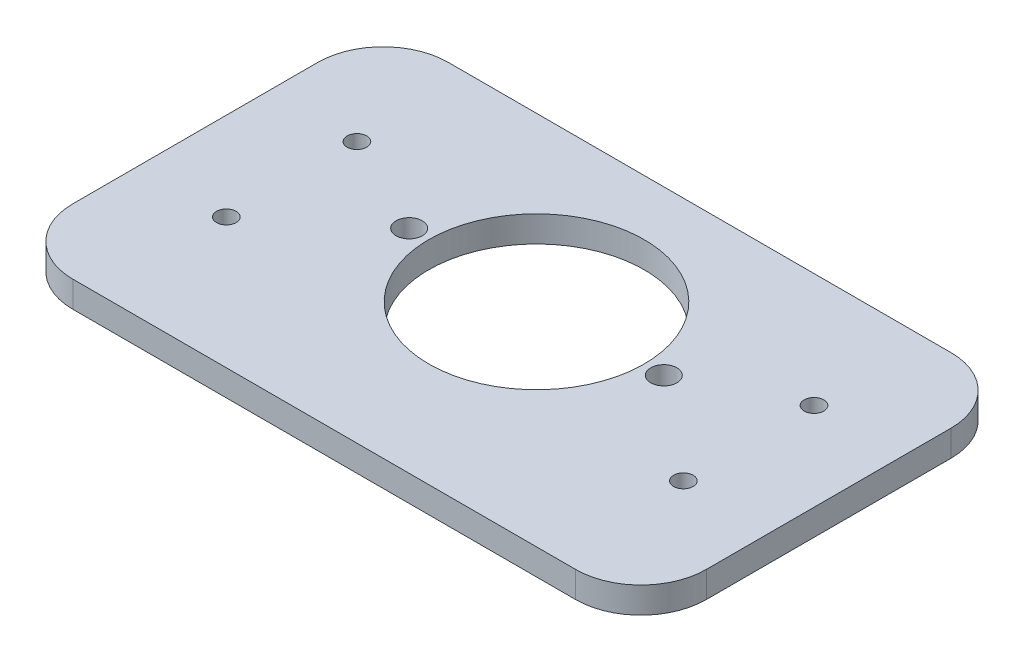
ISO-10303-21;
HEADER;
FILE_DESCRIPTION(('STEP AP214'),'2;1');
FILE_NAME('part.step','',(''),(''),'','','');
FILE_SCHEMA(('AUTOMOTIVE_DESIGN { 1 0 10303 214 1 1 1 1 }'));
ENDSEC;
DATA;
#1=APPLICATION_CONTEXT('core data for automotive mechanical design processes');
#2=APPLICATION_PROTOCOL_DEFINITION('international standard','automotive_design',2000,#1);
#3=PRODUCT_CONTEXT('',#1,'mechanical');
#4=PRODUCT('Part','Part','',(#3));
#5=PRODUCT_RELATED_PRODUCT_CATEGORY('part','',(#4));
#6=PRODUCT_DEFINITION_FORMATION('','',#4);
#7=PRODUCT_DEFINITION_CONTEXT('part definition',#1,'design');
#8=PRODUCT_DEFINITION('design','',#6,#7);
#9=PRODUCT_DEFINITION_SHAPE('','',#8);
#10=(LENGTH_UNIT() NAMED_UNIT(*) SI_UNIT(.MILLI.,.METRE.));
#11=(NAMED_UNIT(*) PLANE_ANGLE_UNIT() SI_UNIT($,.RADIAN.));
#12=(NAMED_UNIT(*) SI_UNIT($,.STERADIAN.) SOLID_ANGLE_UNIT());
#13=UNCERTAINTY_MEASURE_WITH_UNIT(LENGTH_MEASURE(1.E-05),#10,'distance_accuracy_value','');
#14=(GEOMETRIC_REPRESENTATION_CONTEXT(3) GLOBAL_UNCERTAINTY_ASSIGNED_CONTEXT((#13)) GLOBAL_UNIT_ASSIGNED_CONTEXT((#10,
#11,#12)) REPRESENTATION_CONTEXT('',''));
#15=CARTESIAN_POINT('',(0.,0.,0.));
#16=DIRECTION('',(0.,0.,1.));
#17=DIRECTION('',(1.,0.,0.));
#18=AXIS2_PLACEMENT_3D('',#15,#16,#17);
#19=CARTESIAN_POINT('',(0.,4.,0.));
#20=DIRECTION('',(0.,-1.,0.));
#21=DIRECTION('',(0.,0.,-1.));
#22=AXIS2_PLACEMENT_3D('',#19,#20,#21);
#23=PLANE('',#22);
#24=CARTESIAN_POINT('',(83.5,4.,-20.));
#25=DIRECTION('',(0.,1.,0.));
#26=DIRECTION('',(0.,0.,-1.));
#27=AXIS2_PLACEMENT_3D('',#24,#25,#26);
#28=CIRCLE('',#27,1.50000000000001);
#29=CARTESIAN_POINT('',(83.5,4.,-21.5));
#30=VERTEX_POINT('',#29);
#31=EDGE_CURVE('E398',#30,#30,#28,.T.);
#32=ORIENTED_EDGE('',*,*,#31,.F.);
#33=EDGE_LOOP('',(#32));
#34=FACE_BOUND('',#33,.T.);
#35=CARTESIAN_POINT('',(83.5000000000001,4.,-40.));
#36=DIRECTION('',(0.,1.,0.));
#37=DIRECTION('',(0.,0.,-1.));
#38=AXIS2_PLACEMENT_3D('',#35,#36,#37);
#39=CIRCLE('',#38,1.5);
#40=CARTESIAN_POINT('',(83.5000000000001,4.,-41.5));
#41=VERTEX_POINT('',#40);
#42=EDGE_CURVE('E400',#41,#41,#39,.T.);
#43=ORIENTED_EDGE('',*,*,#42,.F.);
#44=EDGE_LOOP('',(#43));
#45=FACE_BOUND('',#44,.T.);
#46=CARTESIAN_POINT('',(13.4999999999999,4.,-40.));
#47=DIRECTION('',(0.,1.,0.));
#48=DIRECTION('',(0.,0.,1.));
#49=AXIS2_PLACEMENT_3D('',#46,#47,#48);
#50=CIRCLE('',#49,1.50000000000001);
#51=CARTESIAN_POINT('',(13.4999999999999,4.,-38.5));
#52=VERTEX_POINT('',#51);
#53=EDGE_CURVE('E404',#52,#52,#50,.T.);
#54=ORIENTED_EDGE('',*,*,#53,.F.);
#55=EDGE_LOOP('',(#54));
#56=FACE_BOUND('',#55,.T.);
#57=CARTESIAN_POINT('',(13.5,4.,-20.));
#58=DIRECTION('',(0.,1.,0.));
#59=DIRECTION('',(0.,0.,1.));
#60=AXIS2_PLACEMENT_3D('',#57,#58,#59);
#61=CIRCLE('',#60,1.50000000000001);
#62=CARTESIAN_POINT('',(13.5,4.,-18.5));
#63=VERTEX_POINT('',#62);
#64=EDGE_CURVE('E193',#63,#63,#61,.T.);
#65=ORIENTED_EDGE('',*,*,#64,.F.);
#66=EDGE_LOOP('',(#65));
#67=FACE_BOUND('',#66,.T.);
#68=DIRECTION('',(0.,0.,1.));
#69=VECTOR('',#68,1.);
#70=CARTESIAN_POINT('',(0.,4.,0.));
#71=LINE('',#70,#69);
#72=CARTESIAN_POINT('',(0.,4.,-47.5));
#73=VERTEX_POINT('',#72);
#74=CARTESIAN_POINT('',(0.,4.,-10.));
#75=VERTEX_POINT('',#74);
#76=EDGE_CURVE('E152',#73,#75,#71,.T.);
#77=ORIENTED_EDGE('',*,*,#76,.T.);
#78=CARTESIAN_POINT('',(10.,4.,-10.));
#79=DIRECTION('',(0.,-1.,0.));
#80=DIRECTION('',(0.,0.,-1.));
#81=AXIS2_PLACEMENT_3D('',#78,#79,#80);
#82=CIRCLE('',#81,10.);
#83=CARTESIAN_POINT('',(10.,4.,0.));
#84=VERTEX_POINT('',#83);
#85=EDGE_CURVE('E176',#75,#84,#82,.F.);
#86=ORIENTED_EDGE('',*,*,#85,.T.);
#87=DIRECTION('',(1.,0.,0.));
#88=VECTOR('',#87,1.);
#89=CARTESIAN_POINT('',(0.,4.,0.));
#90=LINE('',#89,#88);
#91=CARTESIAN_POINT('',(87.,4.,0.));
#92=VERTEX_POINT('',#91);
#93=EDGE_CURVE('E129',#84,#92,#90,.T.);
#94=ORIENTED_EDGE('',*,*,#93,.T.);
#95=CARTESIAN_POINT('',(87.,4.,-10.));
#96=DIRECTION('',(0.,-1.,0.));
#97=DIRECTION('',(0.,0.,-1.));
#98=AXIS2_PLACEMENT_3D('',#95,#96,#97);
#99=CIRCLE('',#98,10.);
#100=CARTESIAN_POINT('',(97.,4.,-10.));
#101=VERTEX_POINT('',#100);
#102=EDGE_CURVE('E173',#92,#101,#99,.F.);
#103=ORIENTED_EDGE('',*,*,#102,.T.);
#104=DIRECTION('',(0.,0.,-1.));
#105=VECTOR('',#104,1.);
#106=CARTESIAN_POINT('',(97.,4.,0.));
#107=LINE('',#106,#105);
#108=CARTESIAN_POINT('',(97.,4.,-47.5));
#109=VERTEX_POINT('',#108);
#110=EDGE_CURVE('E237',#101,#109,#107,.T.);
#111=ORIENTED_EDGE('',*,*,#110,.T.);
#112=CARTESIAN_POINT('',(87.,4.,-47.5));
#113=DIRECTION('',(0.,-1.,0.));
#114=DIRECTION('',(0.,0.,-1.));
#115=AXIS2_PLACEMENT_3D('',#112,#113,#114);
#116=CIRCLE('',#115,10.);
#117=CARTESIAN_POINT('',(87.,4.,-57.5));
#118=VERTEX_POINT('',#117);
#119=EDGE_CURVE('E63',#109,#118,#116,.F.);
#120=ORIENTED_EDGE('',*,*,#119,.T.);
#121=DIRECTION('',(-1.,0.,0.));
#122=VECTOR('',#121,1.);
#123=CARTESIAN_POINT('',(0.,4.,-57.5));
#124=LINE('',#123,#122);
#125=CARTESIAN_POINT('',(10.,4.,-57.5));
#126=VERTEX_POINT('',#125);
#127=EDGE_CURVE('E154',#118,#126,#124,.T.);
#128=ORIENTED_EDGE('',*,*,#127,.T.);
#129=CARTESIAN_POINT('',(10.,4.,-47.5));
#130=DIRECTION('',(0.,-1.,0.));
#131=DIRECTION('',(0.,0.,-1.));
#132=AXIS2_PLACEMENT_3D('',#129,#130,#131);
#133=CIRCLE('',#132,10.);
#134=EDGE_CURVE('E168',#126,#73,#133,.F.);
#135=ORIENTED_EDGE('',*,*,#134,.T.);
#136=EDGE_LOOP('',(#77,#86,#94,#103,#111,#120,#128,#135));
#137=FACE_BOUND('',#136,.T.);
#138=CARTESIAN_POINT('',(48.5,4.,-32.5));
#139=DIRECTION('',(0.,1.,0.));
#140=DIRECTION('',(0.,0.,1.));
#141=AXIS2_PLACEMENT_3D('',#138,#139,#140);
#142=CIRCLE('',#141,16.5);
#143=CARTESIAN_POINT('',(48.5,4.,-16.));
#144=VERTEX_POINT('',#143);
#145=EDGE_CURVE('E146',#144,#144,#142,.T.);
#146=ORIENTED_EDGE('',*,*,#145,.F.);
#147=EDGE_LOOP('',(#146));
#148=FACE_BOUND('',#147,.T.);
#149=CARTESIAN_POINT('',(29.,4.,-32.5));
#150=DIRECTION('',(0.,1.,0.));
#151=DIRECTION('',(0.,0.,1.));
#152=AXIS2_PLACEMENT_3D('',#149,#150,#151);
#153=CIRCLE('',#152,2.00000000000001);
#154=CARTESIAN_POINT('',(29.,4.,-30.5));
#155=VERTEX_POINT('',#154);
#156=EDGE_CURVE('E218',#155,#155,#153,.T.);
#157=ORIENTED_EDGE('',*,*,#156,.F.);
#158=EDGE_LOOP('',(#157));
#159=FACE_BOUND('',#158,.T.);
#160=CARTESIAN_POINT('',(68.,4.,-32.5));
#161=DIRECTION('',(0.,1.,0.));
#162=DIRECTION('',(0.,0.,-1.));
#163=AXIS2_PLACEMENT_3D('',#160,#161,#162);
#164=CIRCLE('',#163,2.);
#165=CARTESIAN_POINT('',(68.,4.,-34.5));
#166=VERTEX_POINT('',#165);
#167=EDGE_CURVE('E208',#166,#166,#164,.T.);
#168=ORIENTED_EDGE('',*,*,#167,.F.);
#169=EDGE_LOOP('',(#168));
#170=FACE_BOUND('',#169,.T.);
#171=ADVANCED_FACE('F39',(#34,#45,#56,#67,#137,#148,#159,#170),#23,.F.);
#172=CARTESIAN_POINT('',(0.,0.,0.));
#173=DIRECTION('',(0.,-1.,0.));
#174=DIRECTION('',(0.,0.,-1.));
#175=AXIS2_PLACEMENT_3D('',#172,#173,#174);
#176=PLANE('',#175);
#177=CARTESIAN_POINT('',(83.5,0.,-20.));
#178=DIRECTION('',(0.,-1.,0.));
#179=DIRECTION('',(0.,0.,-1.));
#180=AXIS2_PLACEMENT_3D('',#177,#178,#179);
#181=CIRCLE('',#180,1.50000000000001);
#182=CARTESIAN_POINT('',(83.5,0.,-21.5));
#183=VERTEX_POINT('',#182);
#184=EDGE_CURVE('E43',#183,#183,#181,.T.);
#185=ORIENTED_EDGE('',*,*,#184,.F.);
#186=EDGE_LOOP('',(#185));
#187=FACE_BOUND('',#186,.T.);
#188=CARTESIAN_POINT('',(83.5000000000001,0.,-40.));
#189=DIRECTION('',(0.,-1.,0.));
#190=DIRECTION('',(0.,0.,-1.));
#191=AXIS2_PLACEMENT_3D('',#188,#189,#190);
#192=CIRCLE('',#191,1.5);
#193=CARTESIAN_POINT('',(83.5000000000001,0.,-41.5));
#194=VERTEX_POINT('',#193);
#195=EDGE_CURVE('E196',#194,#194,#192,.T.);
#196=ORIENTED_EDGE('',*,*,#195,.F.);
#197=EDGE_LOOP('',(#196));
#198=FACE_BOUND('',#197,.T.);
#199=CARTESIAN_POINT('',(13.4999999999999,0.,-40.));
#200=DIRECTION('',(0.,-1.,0.));
#201=DIRECTION('',(0.,0.,-1.));
#202=AXIS2_PLACEMENT_3D('',#199,#200,#201);
#203=CIRCLE('',#202,1.50000000000001);
#204=CARTESIAN_POINT('',(13.4999999999999,0.,-41.5));
#205=VERTEX_POINT('',#204);
#206=EDGE_CURVE('E192',#205,#205,#203,.T.);
#207=ORIENTED_EDGE('',*,*,#206,.F.);
#208=EDGE_LOOP('',(#207));
#209=FACE_BOUND('',#208,.T.);
#210=CARTESIAN_POINT('',(13.5,0.,-20.));
#211=DIRECTION('',(0.,-1.,0.));
#212=DIRECTION('',(0.,0.,-1.));
#213=AXIS2_PLACEMENT_3D('',#210,#211,#212);
#214=CIRCLE('',#213,1.50000000000001);
#215=CARTESIAN_POINT('',(13.5,0.,-21.5));
#216=VERTEX_POINT('',#215);
#217=EDGE_CURVE('E188',#216,#216,#214,.T.);
#218=ORIENTED_EDGE('',*,*,#217,.F.);
#219=EDGE_LOOP('',(#218));
#220=FACE_BOUND('',#219,.T.);
#221=CARTESIAN_POINT('',(29.,0.,-32.5));
#222=DIRECTION('',(0.,1.,0.));
#223=DIRECTION('',(0.,0.,1.));
#224=AXIS2_PLACEMENT_3D('',#221,#222,#223);
#225=CIRCLE('',#224,2.00000000000001);
#226=CARTESIAN_POINT('',(29.,0.,-30.5));
#227=VERTEX_POINT('',#226);
#228=EDGE_CURVE('E214',#227,#227,#225,.T.);
#229=ORIENTED_EDGE('',*,*,#228,.T.);
#230=EDGE_LOOP('',(#229));
#231=FACE_BOUND('',#230,.T.);
#232=DIRECTION('',(1.,0.,0.));
#233=VECTOR('',#232,1.);
#234=CARTESIAN_POINT('',(0.,0.,0.));
#235=LINE('',#234,#233);
#236=CARTESIAN_POINT('',(10.,0.,0.));
#237=VERTEX_POINT('',#236);
#238=CARTESIAN_POINT('',(87.,0.,0.));
#239=VERTEX_POINT('',#238);
#240=EDGE_CURVE('E126',#237,#239,#235,.T.);
#241=ORIENTED_EDGE('',*,*,#240,.F.);
#242=CARTESIAN_POINT('',(10.,0.,-10.));
#243=DIRECTION('',(0.,-1.,0.));
#244=DIRECTION('',(0.,0.,-1.));
#245=AXIS2_PLACEMENT_3D('',#242,#243,#244);
#246=CIRCLE('',#245,10.);
#247=CARTESIAN_POINT('',(0.,0.,-10.));
#248=VERTEX_POINT('',#247);
#249=EDGE_CURVE('E108',#237,#248,#246,.T.);
#250=ORIENTED_EDGE('',*,*,#249,.T.);
#251=DIRECTION('',(0.,0.,1.));
#252=VECTOR('',#251,1.);
#253=CARTESIAN_POINT('',(0.,0.,0.));
#254=LINE('',#253,#252);
#255=CARTESIAN_POINT('',(0.,0.,-47.5));
#256=VERTEX_POINT('',#255);
#257=EDGE_CURVE('E139',#256,#248,#254,.T.);
#258=ORIENTED_EDGE('',*,*,#257,.F.);
#259=CARTESIAN_POINT('',(10.,0.,-47.5));
#260=DIRECTION('',(0.,-1.,0.));
#261=DIRECTION('',(0.,0.,-1.));
#262=AXIS2_PLACEMENT_3D('',#259,#260,#261);
#263=CIRCLE('',#262,10.);
#264=CARTESIAN_POINT('',(10.,0.,-57.5));
#265=VERTEX_POINT('',#264);
#266=EDGE_CURVE('E131',#256,#265,#263,.T.);
#267=ORIENTED_EDGE('',*,*,#266,.T.);
#268=DIRECTION('',(-1.,0.,0.));
#269=VECTOR('',#268,1.);
#270=CARTESIAN_POINT('',(0.,0.,-57.5));
#271=LINE('',#270,#269);
#272=CARTESIAN_POINT('',(87.,0.,-57.5));
#273=VERTEX_POINT('',#272);
#274=EDGE_CURVE('E144',#273,#265,#271,.T.);
#275=ORIENTED_EDGE('',*,*,#274,.F.);
#276=CARTESIAN_POINT('',(87.,0.,-47.5));
#277=DIRECTION('',(0.,-1.,0.));
#278=DIRECTION('',(0.,0.,-1.));
#279=AXIS2_PLACEMENT_3D('',#276,#277,#278);
#280=CIRCLE('',#279,10.);
#281=CARTESIAN_POINT('',(97.,0.,-47.5));
#282=VERTEX_POINT('',#281);
#283=EDGE_CURVE('E158',#273,#282,#280,.T.);
#284=ORIENTED_EDGE('',*,*,#283,.T.);
#285=DIRECTION('',(0.,0.,-1.));
#286=VECTOR('',#285,1.);
#287=CARTESIAN_POINT('',(97.,0.,0.));
#288=LINE('',#287,#286);
#289=CARTESIAN_POINT('',(97.,0.,-10.));
#290=VERTEX_POINT('',#289);
#291=EDGE_CURVE('E138',#290,#282,#288,.T.);
#292=ORIENTED_EDGE('',*,*,#291,.F.);
#293=CARTESIAN_POINT('',(87.,0.,-10.));
#294=DIRECTION('',(0.,-1.,0.));
#295=DIRECTION('',(0.,0.,-1.));
#296=AXIS2_PLACEMENT_3D('',#293,#294,#295);
#297=CIRCLE('',#296,10.);
#298=EDGE_CURVE('E120',#290,#239,#297,.T.);
#299=ORIENTED_EDGE('',*,*,#298,.T.);
#300=EDGE_LOOP('',(#241,#250,#258,#267,#275,#284,#292,#299));
#301=FACE_BOUND('',#300,.T.);
#302=CARTESIAN_POINT('',(48.5,0.,-32.5));
#303=DIRECTION('',(0.,1.,0.));
#304=DIRECTION('',(0.,0.,1.));
#305=AXIS2_PLACEMENT_3D('',#302,#303,#304);
#306=CIRCLE('',#305,16.5);
#307=CARTESIAN_POINT('',(48.5,0.,-16.));
#308=VERTEX_POINT('',#307);
#309=EDGE_CURVE('E222',#308,#308,#306,.T.);
#310=ORIENTED_EDGE('',*,*,#309,.T.);
#311=EDGE_LOOP('',(#310));
#312=FACE_BOUND('',#311,.T.);
#313=CARTESIAN_POINT('',(68.,0.,-32.5));
#314=DIRECTION('',(0.,1.,0.));
#315=DIRECTION('',(0.,0.,-1.));
#316=AXIS2_PLACEMENT_3D('',#313,#314,#315);
#317=CIRCLE('',#316,2.);
#318=CARTESIAN_POINT('',(68.,0.,-34.5));
#319=VERTEX_POINT('',#318);
#320=EDGE_CURVE('E203',#319,#319,#317,.T.);
#321=ORIENTED_EDGE('',*,*,#320,.T.);
#322=EDGE_LOOP('',(#321));
#323=FACE_BOUND('',#322,.T.);
#324=ADVANCED_FACE('F134',(#187,#198,#209,#220,#231,#301,#312,#323),#176,.T.);
#325=CARTESIAN_POINT('',(0.,4.,0.));
#326=DIRECTION('',(1.,0.,0.));
#327=DIRECTION('',(0.,0.,-1.));
#328=AXIS2_PLACEMENT_3D('',#325,#326,#327);
#329=PLANE('',#328);
#330=ORIENTED_EDGE('',*,*,#257,.T.);
#331=DIRECTION('',(0.,-1.,0.));
#332=VECTOR('',#331,1.);
#333=CARTESIAN_POINT('',(0.,4.,-10.));
#334=LINE('',#333,#332);
#335=EDGE_CURVE('E113',#248,#75,#334,.F.);
#336=ORIENTED_EDGE('',*,*,#335,.T.);
#337=ORIENTED_EDGE('',*,*,#76,.F.);
#338=DIRECTION('',(0.,-1.,0.));
#339=VECTOR('',#338,1.);
#340=CARTESIAN_POINT('',(0.,4.,-47.5));
#341=LINE('',#340,#339);
#342=EDGE_CURVE('E119',#73,#256,#341,.T.);
#343=ORIENTED_EDGE('',*,*,#342,.T.);
#344=EDGE_LOOP('',(#330,#336,#337,#343));
#345=FACE_BOUND('',#344,.T.);
#346=ADVANCED_FACE('F247',(#345),#329,.F.);
#347=CARTESIAN_POINT('',(0.,4.,0.));
#348=DIRECTION('',(0.,0.,-1.));
#349=DIRECTION('',(-1.,0.,0.));
#350=AXIS2_PLACEMENT_3D('',#347,#348,#349);
#351=PLANE('',#350);
#352=ORIENTED_EDGE('',*,*,#93,.F.);
#353=DIRECTION('',(0.,-1.,0.));
#354=VECTOR('',#353,1.);
#355=CARTESIAN_POINT('',(10.,4.,0.));
#356=LINE('',#355,#354);
#357=EDGE_CURVE('E112',#84,#237,#356,.T.);
#358=ORIENTED_EDGE('',*,*,#357,.T.);
#359=ORIENTED_EDGE('',*,*,#240,.T.);
#360=DIRECTION('',(0.,-1.,0.));
#361=VECTOR('',#360,1.);
#362=CARTESIAN_POINT('',(87.,4.,0.));
#363=LINE('',#362,#361);
#364=EDGE_CURVE('E132',#239,#92,#363,.F.);
#365=ORIENTED_EDGE('',*,*,#364,.T.);
#366=EDGE_LOOP('',(#352,#358,#359,#365));
#367=FACE_BOUND('',#366,.T.);
#368=ADVANCED_FACE('F125',(#367),#351,.F.);
#369=CARTESIAN_POINT('',(97.,4.,0.));
#370=DIRECTION('',(-1.,0.,0.));
#371=DIRECTION('',(0.,0.,1.));
#372=AXIS2_PLACEMENT_3D('',#369,#370,#371);
#373=PLANE('',#372);
#374=ORIENTED_EDGE('',*,*,#110,.F.);
#375=DIRECTION('',(0.,-1.,0.));
#376=VECTOR('',#375,1.);
#377=CARTESIAN_POINT('',(97.,4.,-10.));
#378=LINE('',#377,#376);
#379=EDGE_CURVE('E182',#101,#290,#378,.T.);
#380=ORIENTED_EDGE('',*,*,#379,.T.);
#381=ORIENTED_EDGE('',*,*,#291,.T.);
#382=DIRECTION('',(0.,-1.,0.));
#383=VECTOR('',#382,1.);
#384=CARTESIAN_POINT('',(97.,4.,-47.5));
#385=LINE('',#384,#383);
#386=EDGE_CURVE('E179',#282,#109,#385,.F.);
#387=ORIENTED_EDGE('',*,*,#386,.T.);
#388=EDGE_LOOP('',(#374,#380,#381,#387));
#389=FACE_BOUND('',#388,.T.);
#390=ADVANCED_FACE('F255',(#389),#373,.F.);
#391=CARTESIAN_POINT('',(0.,4.,-57.5));
#392=DIRECTION('',(0.,0.,1.));
#393=DIRECTION('',(1.,0.,0.));
#394=AXIS2_PLACEMENT_3D('',#391,#392,#393);
#395=PLANE('',#394);
#396=ORIENTED_EDGE('',*,*,#127,.F.);
#397=DIRECTION('',(0.,-1.,0.));
#398=VECTOR('',#397,1.);
#399=CARTESIAN_POINT('',(87.,4.,-57.5));
#400=LINE('',#399,#398);
#401=EDGE_CURVE('E11',#118,#273,#400,.T.);
#402=ORIENTED_EDGE('',*,*,#401,.T.);
#403=ORIENTED_EDGE('',*,*,#274,.T.);
#404=DIRECTION('',(0.,-1.,0.));
#405=VECTOR('',#404,1.);
#406=CARTESIAN_POINT('',(10.,4.,-57.5));
#407=LINE('',#406,#405);
#408=EDGE_CURVE('E49',#265,#126,#407,.F.);
#409=ORIENTED_EDGE('',*,*,#408,.T.);
#410=EDGE_LOOP('',(#396,#402,#403,#409));
#411=FACE_BOUND('',#410,.T.);
#412=ADVANCED_FACE('F249',(#411),#395,.F.);
#413=CARTESIAN_POINT('',(48.5,4.,-32.5));
#414=DIRECTION('',(0.,-1.,0.));
#415=DIRECTION('',(0.,0.,-1.));
#416=AXIS2_PLACEMENT_3D('',#413,#414,#415);
#417=CYLINDRICAL_SURFACE('',#416,16.5);
#418=ORIENTED_EDGE('',*,*,#145,.T.);
#419=EDGE_LOOP('',(#418));
#420=FACE_BOUND('',#419,.T.);
#421=ORIENTED_EDGE('',*,*,#309,.F.);
#422=EDGE_LOOP('',(#421));
#423=FACE_BOUND('',#422,.T.);
#424=ADVANCED_FACE('F279',(#420,#423),#417,.F.);
#425=CARTESIAN_POINT('',(29.,4.,-32.5));
#426=DIRECTION('',(0.,-1.,0.));
#427=DIRECTION('',(0.,0.,-1.));
#428=AXIS2_PLACEMENT_3D('',#425,#426,#427);
#429=CYLINDRICAL_SURFACE('',#428,2.00000000000001);
#430=ORIENTED_EDGE('',*,*,#156,.T.);
#431=EDGE_LOOP('',(#430));
#432=FACE_BOUND('',#431,.T.);
#433=ORIENTED_EDGE('',*,*,#228,.F.);
#434=EDGE_LOOP('',(#433));
#435=FACE_BOUND('',#434,.T.);
#436=ADVANCED_FACE('F313',(#432,#435),#429,.F.);
#437=CARTESIAN_POINT('',(68.,4.,-32.5));
#438=DIRECTION('',(0.,-1.,0.));
#439=DIRECTION('',(0.,0.,-1.));
#440=AXIS2_PLACEMENT_3D('',#437,#438,#439);
#441=CYLINDRICAL_SURFACE('',#440,2.);
#442=ORIENTED_EDGE('',*,*,#167,.T.);
#443=EDGE_LOOP('',(#442));
#444=FACE_BOUND('',#443,.T.);
#445=ORIENTED_EDGE('',*,*,#320,.F.);
#446=EDGE_LOOP('',(#445));
#447=FACE_BOUND('',#446,.T.);
#448=ADVANCED_FACE('F266',(#444,#447),#441,.F.);
#449=CARTESIAN_POINT('',(10.,4.,-10.));
#450=DIRECTION('',(0.,-1.,0.));
#451=DIRECTION('',(0.,0.,-1.));
#452=AXIS2_PLACEMENT_3D('',#449,#450,#451);
#453=CYLINDRICAL_SURFACE('',#452,10.);
#454=ORIENTED_EDGE('',*,*,#85,.F.);
#455=ORIENTED_EDGE('',*,*,#335,.F.);
#456=ORIENTED_EDGE('',*,*,#249,.F.);
#457=ORIENTED_EDGE('',*,*,#357,.F.);
#458=EDGE_LOOP('',(#454,#455,#456,#457));
#459=FACE_BOUND('',#458,.T.);
#460=ADVANCED_FACE('F111',(#459),#453,.T.);
#461=CARTESIAN_POINT('',(87.,4.,-10.));
#462=DIRECTION('',(0.,-1.,0.));
#463=DIRECTION('',(0.,0.,-1.));
#464=AXIS2_PLACEMENT_3D('',#461,#462,#463);
#465=CYLINDRICAL_SURFACE('',#464,10.);
#466=ORIENTED_EDGE('',*,*,#102,.F.);
#467=ORIENTED_EDGE('',*,*,#364,.F.);
#468=ORIENTED_EDGE('',*,*,#298,.F.);
#469=ORIENTED_EDGE('',*,*,#379,.F.);
#470=EDGE_LOOP('',(#466,#467,#468,#469));
#471=FACE_BOUND('',#470,.T.);
#472=ADVANCED_FACE('F259',(#471),#465,.T.);
#473=CARTESIAN_POINT('',(87.,4.,-47.5));
#474=DIRECTION('',(0.,-1.,0.));
#475=DIRECTION('',(0.,0.,-1.));
#476=AXIS2_PLACEMENT_3D('',#473,#474,#475);
#477=CYLINDRICAL_SURFACE('',#476,10.);
#478=ORIENTED_EDGE('',*,*,#119,.F.);
#479=ORIENTED_EDGE('',*,*,#386,.F.);
#480=ORIENTED_EDGE('',*,*,#283,.F.);
#481=ORIENTED_EDGE('',*,*,#401,.F.);
#482=EDGE_LOOP('',(#478,#479,#480,#481));
#483=FACE_BOUND('',#482,.T.);
#484=ADVANCED_FACE('F251',(#483),#477,.T.);
#485=CARTESIAN_POINT('',(10.,4.,-47.5));
#486=DIRECTION('',(0.,-1.,0.));
#487=DIRECTION('',(0.,0.,-1.));
#488=AXIS2_PLACEMENT_3D('',#485,#486,#487);
#489=CYLINDRICAL_SURFACE('',#488,10.);
#490=ORIENTED_EDGE('',*,*,#134,.F.);
#491=ORIENTED_EDGE('',*,*,#408,.F.);
#492=ORIENTED_EDGE('',*,*,#266,.F.);
#493=ORIENTED_EDGE('',*,*,#342,.F.);
#494=EDGE_LOOP('',(#490,#491,#492,#493));
#495=FACE_BOUND('',#494,.T.);
#496=ADVANCED_FACE('F41',(#495),#489,.T.);
#497=CARTESIAN_POINT('',(13.5,-6.,-20.));
#498=DIRECTION('',(0.,1.,0.));
#499=DIRECTION('',(0.,0.,1.));
#500=AXIS2_PLACEMENT_3D('',#497,#498,#499);
#501=CYLINDRICAL_SURFACE('',#500,1.50000000000001);
#502=ORIENTED_EDGE('',*,*,#217,.T.);
#503=EDGE_LOOP('',(#502));
#504=FACE_BOUND('',#503,.T.);
#505=ORIENTED_EDGE('',*,*,#64,.T.);
#506=EDGE_LOOP('',(#505));
#507=FACE_BOUND('',#506,.T.);
#508=ADVANCED_FACE('F347',(#504,#507),#501,.F.);
#509=CARTESIAN_POINT('',(13.4999999999999,-6.,-40.));
#510=DIRECTION('',(0.,1.,0.));
#511=DIRECTION('',(0.,0.,1.));
#512=AXIS2_PLACEMENT_3D('',#509,#510,#511);
#513=CYLINDRICAL_SURFACE('',#512,1.50000000000001);
#514=ORIENTED_EDGE('',*,*,#206,.T.);
#515=EDGE_LOOP('',(#514));
#516=FACE_BOUND('',#515,.T.);
#517=ORIENTED_EDGE('',*,*,#53,.T.);
#518=EDGE_LOOP('',(#517));
#519=FACE_BOUND('',#518,.T.);
#520=ADVANCED_FACE('F364',(#516,#519),#513,.F.);
#521=CARTESIAN_POINT('',(83.5000000000001,-6.,-40.));
#522=DIRECTION('',(0.,1.,0.));
#523=DIRECTION('',(0.,0.,1.));
#524=AXIS2_PLACEMENT_3D('',#521,#522,#523);
#525=CYLINDRICAL_SURFACE('',#524,1.5);
#526=ORIENTED_EDGE('',*,*,#195,.T.);
#527=EDGE_LOOP('',(#526));
#528=FACE_BOUND('',#527,.T.);
#529=ORIENTED_EDGE('',*,*,#42,.T.);
#530=EDGE_LOOP('',(#529));
#531=FACE_BOUND('',#530,.T.);
#532=ADVANCED_FACE('F374',(#528,#531),#525,.F.);
#533=CARTESIAN_POINT('',(83.5,-6.,-20.));
#534=DIRECTION('',(0.,1.,0.));
#535=DIRECTION('',(0.,0.,1.));
#536=AXIS2_PLACEMENT_3D('',#533,#534,#535);
#537=CYLINDRICAL_SURFACE('',#536,1.50000000000001);
#538=ORIENTED_EDGE('',*,*,#184,.T.);
#539=EDGE_LOOP('',(#538));
#540=FACE_BOUND('',#539,.T.);
#541=ORIENTED_EDGE('',*,*,#31,.T.);
#542=EDGE_LOOP('',(#541));
#543=FACE_BOUND('',#542,.T.);
#544=ADVANCED_FACE('F384',(#540,#543),#537,.F.);
#545=CLOSED_SHELL('',(#171,#324,#346,#368,#390,#412,#424,#436,#448,#460,#472,#484,#496,#508,
#520,#532,#544));
#546=MANIFOLD_SOLID_BREP('B2',#545);
#547=ADVANCED_BREP_SHAPE_REPRESENTATION('',(#18,#546),#14);
#548=SHAPE_DEFINITION_REPRESENTATION(#9,#547);
ENDSEC;
END-ISO-10303-21;
